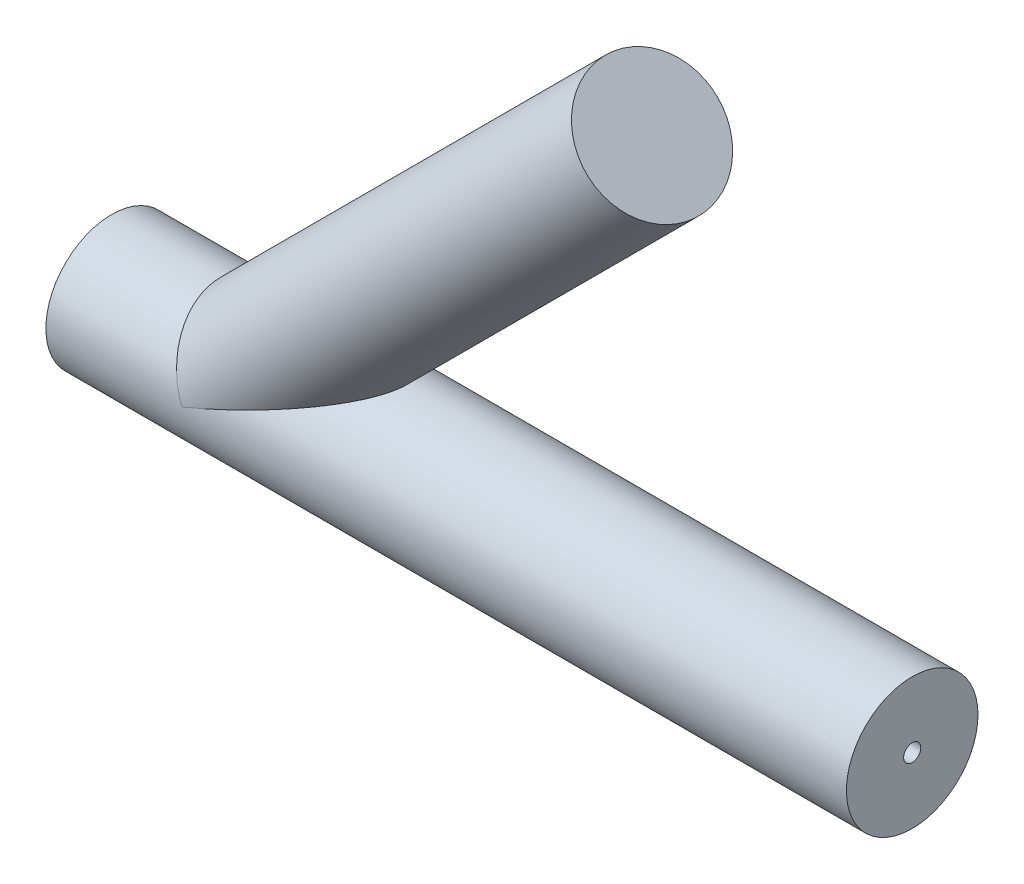
ISO-10303-21;
HEADER;
FILE_DESCRIPTION(('STEP AP214'),'2;1');
FILE_NAME('part.step','',(''),(''),'','','');
FILE_SCHEMA(('AUTOMOTIVE_DESIGN { 1 0 10303 214 1 1 1 1 }'));
ENDSEC;
DATA;
#1=APPLICATION_CONTEXT('core data for automotive mechanical design processes');
#2=APPLICATION_PROTOCOL_DEFINITION('international standard','automotive_design',2000,#1);
#3=PRODUCT_CONTEXT('',#1,'mechanical');
#4=PRODUCT('Part','Part','',(#3));
#5=PRODUCT_RELATED_PRODUCT_CATEGORY('part','',(#4));
#6=PRODUCT_DEFINITION_FORMATION('','',#4);
#7=PRODUCT_DEFINITION_CONTEXT('part definition',#1,'design');
#8=PRODUCT_DEFINITION('design','',#6,#7);
#9=PRODUCT_DEFINITION_SHAPE('','',#8);
#10=(LENGTH_UNIT() NAMED_UNIT(*) SI_UNIT(.MILLI.,.METRE.));
#11=(NAMED_UNIT(*) PLANE_ANGLE_UNIT() SI_UNIT($,.RADIAN.));
#12=(NAMED_UNIT(*) SI_UNIT($,.STERADIAN.) SOLID_ANGLE_UNIT());
#13=UNCERTAINTY_MEASURE_WITH_UNIT(LENGTH_MEASURE(1.E-05),#10,'distance_accuracy_value','');
#14=(GEOMETRIC_REPRESENTATION_CONTEXT(3) GLOBAL_UNCERTAINTY_ASSIGNED_CONTEXT((#13)) GLOBAL_UNIT_ASSIGNED_CONTEXT((#10,
#11,#12)) REPRESENTATION_CONTEXT('',''));
#15=CARTESIAN_POINT('',(0.,0.,0.));
#16=DIRECTION('',(0.,0.,1.));
#17=DIRECTION('',(1.,0.,0.));
#18=AXIS2_PLACEMENT_3D('',#15,#16,#17);
#19=CARTESIAN_POINT('',(343.,0.,0.));
#20=DIRECTION('',(-1.,0.,0.));
#21=DIRECTION('',(0.,0.,1.));
#22=AXIS2_PLACEMENT_3D('',#19,#20,#21);
#23=CYLINDRICAL_SURFACE('',#22,28.194);
#24=CARTESIAN_POINT('',(0.,0.,0.));
#25=DIRECTION('',(1.,0.,0.));
#26=DIRECTION('',(0.,0.,-1.));
#27=AXIS2_PLACEMENT_3D('',#24,#25,#26);
#28=CIRCLE('',#27,28.194);
#29=CARTESIAN_POINT('',(0.,0.,-28.194));
#30=VERTEX_POINT('',#29);
#31=EDGE_CURVE('E52',#30,#30,#28,.T.);
#32=ORIENTED_EDGE('',*,*,#31,.T.);
#33=EDGE_LOOP('',(#32));
#34=FACE_BOUND('',#33,.T.);
#35=CARTESIAN_POINT('',(343.,0.,0.));
#36=DIRECTION('',(1.,0.,0.));
#37=DIRECTION('',(0.,0.,-1.));
#38=AXIS2_PLACEMENT_3D('',#35,#36,#37);
#39=CIRCLE('',#38,28.194);
#40=CARTESIAN_POINT('',(343.,0.,-28.194));
#41=VERTEX_POINT('',#40);
#42=EDGE_CURVE('E50',#41,#41,#39,.T.);
#43=ORIENTED_EDGE('',*,*,#42,.F.);
#44=EDGE_LOOP('',(#43));
#45=FACE_BOUND('',#44,.T.);
#46=CARTESIAN_POINT('',(58.3,0.,0.));
#47=DIRECTION('',(-0.923879532511287,-0.382683432365089,0.));
#48=DIRECTION('',(-0.382683432365089,0.923879532511287,0.));
#49=AXIS2_PLACEMENT_3D('',#46,#47,#48);
#50=ELLIPSE('',#49,30.5169656950437,28.194);
#51=CARTESIAN_POINT('',(58.3,0.,-28.194));
#52=VERTEX_POINT('',#51);
#53=CARTESIAN_POINT('',(58.3,0.,28.194));
#54=VERTEX_POINT('',#53);
#55=EDGE_CURVE('E11',#52,#54,#50,.F.);
#56=ORIENTED_EDGE('',*,*,#55,.F.);
#57=CARTESIAN_POINT('',(58.3,0.,0.));
#58=DIRECTION('',(-0.382683432365089,0.923879532511287,0.));
#59=DIRECTION('',(-0.923879532511287,-0.382683432365089,0.));
#60=AXIS2_PLACEMENT_3D('',#57,#58,#59);
#61=ELLIPSE('',#60,73.6744724634493,28.194);
#62=EDGE_CURVE('E42',#54,#52,#61,.T.);
#63=ORIENTED_EDGE('',*,*,#62,.F.);
#64=EDGE_LOOP('',(#56,#63));
#65=FACE_BOUND('',#64,.T.);
#66=ADVANCED_FACE('F35',(#34,#45,#65),#23,.T.);
#67=CARTESIAN_POINT('',(343.,0.,0.));
#68=DIRECTION('',(1.,0.,0.));
#69=DIRECTION('',(0.,0.,-1.));
#70=AXIS2_PLACEMENT_3D('',#67,#68,#69);
#71=PLANE('',#70);
#72=CARTESIAN_POINT('',(343.,0.,0.));
#73=DIRECTION('',(1.,0.,0.));
#74=DIRECTION('',(0.,0.,-1.));
#75=AXIS2_PLACEMENT_3D('',#72,#73,#74);
#76=CIRCLE('',#75,3.675);
#77=CARTESIAN_POINT('',(343.,0.,-3.675));
#78=VERTEX_POINT('',#77);
#79=EDGE_CURVE('E60',#78,#78,#76,.T.);
#80=ORIENTED_EDGE('',*,*,#79,.F.);
#81=EDGE_LOOP('',(#80));
#82=FACE_BOUND('',#81,.T.);
#83=ORIENTED_EDGE('',*,*,#42,.T.);
#84=EDGE_LOOP('',(#83));
#85=FACE_BOUND('',#84,.T.);
#86=ADVANCED_FACE('F72',(#82,#85),#71,.T.);
#87=CARTESIAN_POINT('',(0.,0.,0.));
#88=DIRECTION('',(1.,0.,0.));
#89=DIRECTION('',(0.,0.,-1.));
#90=AXIS2_PLACEMENT_3D('',#87,#88,#89);
#91=PLANE('',#90);
#92=CARTESIAN_POINT('',(0.,0.,0.));
#93=DIRECTION('',(-1.,0.,0.));
#94=DIRECTION('',(0.,0.,1.));
#95=AXIS2_PLACEMENT_3D('',#92,#93,#94);
#96=CIRCLE('',#95,3.675);
#97=CARTESIAN_POINT('',(0.,0.,3.675));
#98=VERTEX_POINT('',#97);
#99=EDGE_CURVE('E63',#98,#98,#96,.T.);
#100=ORIENTED_EDGE('',*,*,#99,.F.);
#101=EDGE_LOOP('',(#100));
#102=FACE_BOUND('',#101,.T.);
#103=ORIENTED_EDGE('',*,*,#31,.F.);
#104=EDGE_LOOP('',(#103));
#105=FACE_BOUND('',#104,.T.);
#106=ADVANCED_FACE('F69',(#102,#105),#91,.F.);
#107=CARTESIAN_POINT('',(231.541161390704,173.241161390704,0.));
#108=DIRECTION('',(-0.707106781186549,-0.707106781186546,0.));
#109=DIRECTION('',(0.707106781186546,-0.707106781186549,0.));
#110=AXIS2_PLACEMENT_3D('',#107,#108,#109);
#111=CYLINDRICAL_SURFACE('',#110,28.194);
#112=CARTESIAN_POINT('',(231.541161390704,173.241161390704,0.));
#113=DIRECTION('',(0.707106781186549,0.707106781186546,0.));
#114=DIRECTION('',(-0.707106781186546,0.707106781186549,0.));
#115=AXIS2_PLACEMENT_3D('',#112,#113,#114);
#116=CIRCLE('',#115,28.194);
#117=CARTESIAN_POINT('',(211.604992801931,193.177329979477,0.));
#118=VERTEX_POINT('',#117);
#119=EDGE_CURVE('E56',#118,#118,#116,.T.);
#120=ORIENTED_EDGE('',*,*,#119,.F.);
#121=EDGE_LOOP('',(#120));
#122=FACE_BOUND('',#121,.T.);
#123=ORIENTED_EDGE('',*,*,#62,.T.);
#124=ORIENTED_EDGE('',*,*,#55,.T.);
#125=EDGE_LOOP('',(#123,#124));
#126=FACE_BOUND('',#125,.T.);
#127=ADVANCED_FACE('F49',(#122,#126),#111,.T.);
#128=CARTESIAN_POINT('',(231.541161390704,173.241161390704,0.));
#129=DIRECTION('',(0.707106781186549,0.707106781186546,0.));
#130=DIRECTION('',(-0.707106781186546,0.707106781186549,0.));
#131=AXIS2_PLACEMENT_3D('',#128,#129,#130);
#132=PLANE('',#131);
#133=ORIENTED_EDGE('',*,*,#119,.T.);
#134=EDGE_LOOP('',(#133));
#135=FACE_BOUND('',#134,.T.);
#136=ADVANCED_FACE('F88',(#135),#132,.T.);
#137=CARTESIAN_POINT('',(369.4,0.,0.));
#138=DIRECTION('',(-1.,0.,0.));
#139=DIRECTION('',(0.,0.,1.));
#140=AXIS2_PLACEMENT_3D('',#137,#138,#139);
#141=CYLINDRICAL_SURFACE('',#140,3.675);
#142=ORIENTED_EDGE('',*,*,#79,.T.);
#143=EDGE_LOOP('',(#142));
#144=FACE_BOUND('',#143,.T.);
#145=ORIENTED_EDGE('',*,*,#99,.T.);
#146=EDGE_LOOP('',(#145));
#147=FACE_BOUND('',#146,.T.);
#148=ADVANCED_FACE('F67',(#144,#147),#141,.F.);
#149=CLOSED_SHELL('',(#66,#86,#106,#127,#136,#148));
#150=MANIFOLD_SOLID_BREP('B2',#149);
#151=ADVANCED_BREP_SHAPE_REPRESENTATION('',(#18,#150),#14);
#152=SHAPE_DEFINITION_REPRESENTATION(#9,#151);
ENDSEC;
END-ISO-10303-21;
